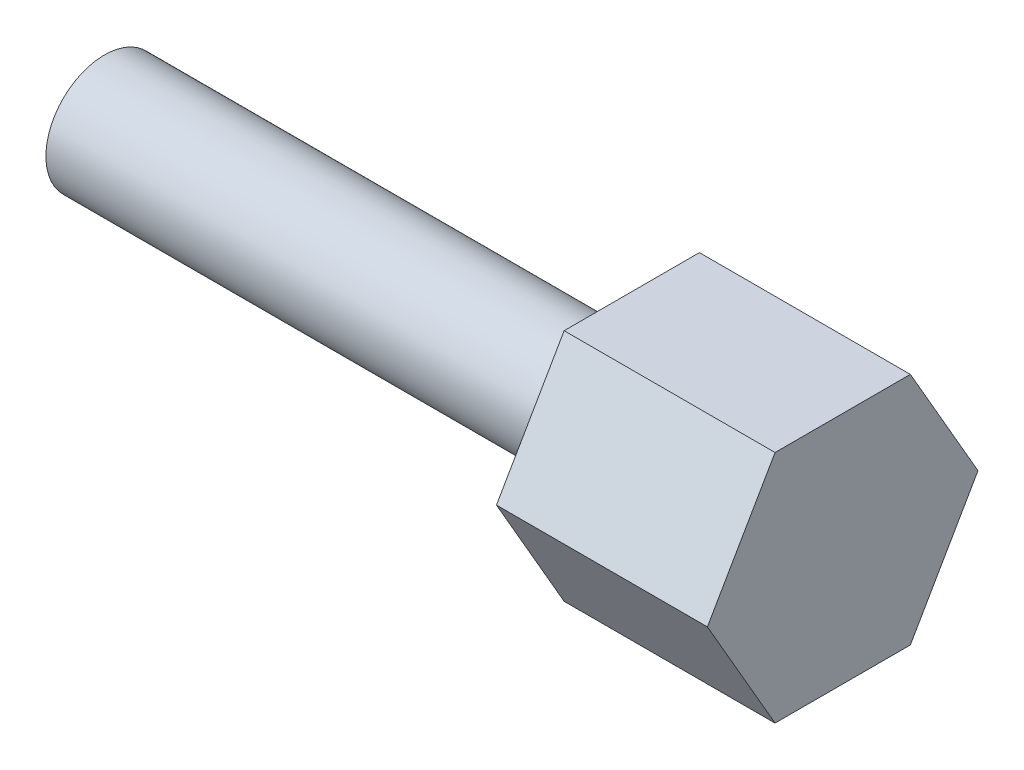
ISO-10303-21;
HEADER;
FILE_DESCRIPTION(('STEP AP214'),'2;1');
FILE_NAME('part.step','',(''),(''),'','','');
FILE_SCHEMA(('AUTOMOTIVE_DESIGN { 1 0 10303 214 1 1 1 1 }'));
ENDSEC;
DATA;
#1=APPLICATION_CONTEXT('core data for automotive mechanical design processes');
#2=APPLICATION_PROTOCOL_DEFINITION('international standard','automotive_design',2000,#1);
#3=PRODUCT_CONTEXT('',#1,'mechanical');
#4=PRODUCT('Part','Part','',(#3));
#5=PRODUCT_RELATED_PRODUCT_CATEGORY('part','',(#4));
#6=PRODUCT_DEFINITION_FORMATION('','',#4);
#7=PRODUCT_DEFINITION_CONTEXT('part definition',#1,'design');
#8=PRODUCT_DEFINITION('design','',#6,#7);
#9=PRODUCT_DEFINITION_SHAPE('','',#8);
#10=(LENGTH_UNIT() NAMED_UNIT(*) SI_UNIT(.MILLI.,.METRE.));
#11=(NAMED_UNIT(*) PLANE_ANGLE_UNIT() SI_UNIT($,.RADIAN.));
#12=(NAMED_UNIT(*) SI_UNIT($,.STERADIAN.) SOLID_ANGLE_UNIT());
#13=UNCERTAINTY_MEASURE_WITH_UNIT(LENGTH_MEASURE(1.E-05),#10,'distance_accuracy_value','');
#14=(GEOMETRIC_REPRESENTATION_CONTEXT(3) GLOBAL_UNCERTAINTY_ASSIGNED_CONTEXT((#13)) GLOBAL_UNIT_ASSIGNED_CONTEXT((#10,
#11,#12)) REPRESENTATION_CONTEXT('',''));
#15=CARTESIAN_POINT('',(0.,0.,0.));
#16=DIRECTION('',(0.,0.,1.));
#17=DIRECTION('',(1.,0.,0.));
#18=AXIS2_PLACEMENT_3D('',#15,#16,#17);
#19=CARTESIAN_POINT('',(11.43,-3.175,-5.49926131403119));
#20=DIRECTION('',(0.,0.5,0.866025403784439));
#21=DIRECTION('',(0.,-0.866025403784439,0.5));
#22=AXIS2_PLACEMENT_3D('',#19,#20,#21);
#23=PLANE('',#22);
#24=DIRECTION('',(0.,0.866025403784439,-0.5));
#25=VECTOR('',#24,1.);
#26=CARTESIAN_POINT('',(0.,-3.175,-5.49926131403119));
#27=LINE('',#26,#25);
#28=CARTESIAN_POINT('',(0.,-6.35,-3.66617420935412));
#29=VERTEX_POINT('',#28);
#30=CARTESIAN_POINT('',(0.,0.,-7.33234841870825));
#31=VERTEX_POINT('',#30);
#32=EDGE_CURVE('E118',#29,#31,#27,.T.);
#33=ORIENTED_EDGE('',*,*,#32,.T.);
#34=DIRECTION('',(-1.,0.,0.));
#35=VECTOR('',#34,1.);
#36=CARTESIAN_POINT('',(11.43,0.,-7.33234841870825));
#37=LINE('',#36,#35);
#38=CARTESIAN_POINT('',(11.43,0.,-7.33234841870825));
#39=VERTEX_POINT('',#38);
#40=EDGE_CURVE('E11',#39,#31,#37,.T.);
#41=ORIENTED_EDGE('',*,*,#40,.F.);
#42=DIRECTION('',(0.,0.866025403784439,-0.5));
#43=VECTOR('',#42,1.);
#44=CARTESIAN_POINT('',(11.43,-3.175,-5.49926131403119));
#45=LINE('',#44,#43);
#46=CARTESIAN_POINT('',(11.43,-6.35,-3.66617420935412));
#47=VERTEX_POINT('',#46);
#48=EDGE_CURVE('E129',#47,#39,#45,.T.);
#49=ORIENTED_EDGE('',*,*,#48,.F.);
#50=DIRECTION('',(-1.,0.,0.));
#51=VECTOR('',#50,1.);
#52=CARTESIAN_POINT('',(11.43,-6.35,-3.66617420935412));
#53=LINE('',#52,#51);
#54=EDGE_CURVE('E114',#47,#29,#53,.T.);
#55=ORIENTED_EDGE('',*,*,#54,.T.);
#56=EDGE_LOOP('',(#33,#41,#49,#55));
#57=FACE_BOUND('',#56,.T.);
#58=ADVANCED_FACE('F34',(#57),#23,.F.);
#59=CARTESIAN_POINT('',(11.43,3.175,-5.49926131403118));
#60=DIRECTION('',(0.,-0.5,0.866025403784438));
#61=DIRECTION('',(0.,-0.866025403784439,-0.5));
#62=AXIS2_PLACEMENT_3D('',#59,#60,#61);
#63=PLANE('',#62);
#64=DIRECTION('',(0.,0.866025403784438,0.5));
#65=VECTOR('',#64,1.);
#66=CARTESIAN_POINT('',(0.,3.175,-5.49926131403118));
#67=LINE('',#66,#65);
#68=CARTESIAN_POINT('',(0.,6.35,-3.66617420935412));
#69=VERTEX_POINT('',#68);
#70=EDGE_CURVE('E121',#31,#69,#67,.T.);
#71=ORIENTED_EDGE('',*,*,#70,.T.);
#72=DIRECTION('',(-1.,0.,0.));
#73=VECTOR('',#72,1.);
#74=CARTESIAN_POINT('',(11.43,6.35,-3.66617420935412));
#75=LINE('',#74,#73);
#76=CARTESIAN_POINT('',(11.43,6.35,-3.66617420935412));
#77=VERTEX_POINT('',#76);
#78=EDGE_CURVE('E42',#77,#69,#75,.T.);
#79=ORIENTED_EDGE('',*,*,#78,.F.);
#80=DIRECTION('',(0.,0.866025403784438,0.5));
#81=VECTOR('',#80,1.);
#82=CARTESIAN_POINT('',(11.43,3.175,-5.49926131403118));
#83=LINE('',#82,#81);
#84=EDGE_CURVE('E87',#39,#77,#83,.T.);
#85=ORIENTED_EDGE('',*,*,#84,.F.);
#86=ORIENTED_EDGE('',*,*,#40,.T.);
#87=EDGE_LOOP('',(#71,#79,#85,#86));
#88=FACE_BOUND('',#87,.T.);
#89=ADVANCED_FACE('F153',(#88),#63,.F.);
#90=CARTESIAN_POINT('',(11.43,6.35,0.));
#91=DIRECTION('',(0.,-1.,0.));
#92=DIRECTION('',(0.,0.,-1.));
#93=AXIS2_PLACEMENT_3D('',#90,#91,#92);
#94=PLANE('',#93);
#95=DIRECTION('',(0.,0.,1.));
#96=VECTOR('',#95,1.);
#97=CARTESIAN_POINT('',(0.,6.35,0.));
#98=LINE('',#97,#96);
#99=CARTESIAN_POINT('',(0.,6.35,3.66617420935412));
#100=VERTEX_POINT('',#99);
#101=EDGE_CURVE('E124',#69,#100,#98,.T.);
#102=ORIENTED_EDGE('',*,*,#101,.T.);
#103=DIRECTION('',(-1.,0.,0.));
#104=VECTOR('',#103,1.);
#105=CARTESIAN_POINT('',(11.43,6.35,3.66617420935412));
#106=LINE('',#105,#104);
#107=CARTESIAN_POINT('',(11.43,6.35,3.66617420935412));
#108=VERTEX_POINT('',#107);
#109=EDGE_CURVE('E109',#108,#100,#106,.T.);
#110=ORIENTED_EDGE('',*,*,#109,.F.);
#111=DIRECTION('',(0.,0.,1.));
#112=VECTOR('',#111,1.);
#113=CARTESIAN_POINT('',(11.43,6.35,0.));
#114=LINE('',#113,#112);
#115=EDGE_CURVE('E100',#77,#108,#114,.T.);
#116=ORIENTED_EDGE('',*,*,#115,.F.);
#117=ORIENTED_EDGE('',*,*,#78,.T.);
#118=EDGE_LOOP('',(#102,#110,#116,#117));
#119=FACE_BOUND('',#118,.T.);
#120=ADVANCED_FACE('F135',(#119),#94,.F.);
#121=CARTESIAN_POINT('',(11.43,3.175,5.49926131403119));
#122=DIRECTION('',(0.,-0.5,-0.866025403784439));
#123=DIRECTION('',(0.,0.866025403784439,-0.5));
#124=AXIS2_PLACEMENT_3D('',#121,#122,#123);
#125=PLANE('',#124);
#126=DIRECTION('',(0.,-0.866025403784439,0.5));
#127=VECTOR('',#126,1.);
#128=CARTESIAN_POINT('',(0.,3.175,5.49926131403119));
#129=LINE('',#128,#127);
#130=CARTESIAN_POINT('',(0.,0.,7.33234841870824));
#131=VERTEX_POINT('',#130);
#132=EDGE_CURVE('E108',#100,#131,#129,.T.);
#133=ORIENTED_EDGE('',*,*,#132,.T.);
#134=DIRECTION('',(-1.,0.,0.));
#135=VECTOR('',#134,1.);
#136=CARTESIAN_POINT('',(11.43,0.,7.33234841870824));
#137=LINE('',#136,#135);
#138=CARTESIAN_POINT('',(11.43,0.,7.33234841870824));
#139=VERTEX_POINT('',#138);
#140=EDGE_CURVE('E105',#139,#131,#137,.T.);
#141=ORIENTED_EDGE('',*,*,#140,.F.);
#142=DIRECTION('',(0.,-0.866025403784439,0.5));
#143=VECTOR('',#142,1.);
#144=CARTESIAN_POINT('',(11.43,3.175,5.49926131403119));
#145=LINE('',#144,#143);
#146=EDGE_CURVE('E94',#108,#139,#145,.T.);
#147=ORIENTED_EDGE('',*,*,#146,.F.);
#148=ORIENTED_EDGE('',*,*,#109,.T.);
#149=EDGE_LOOP('',(#133,#141,#147,#148));
#150=FACE_BOUND('',#149,.T.);
#151=ADVANCED_FACE('F106',(#150),#125,.F.);
#152=CARTESIAN_POINT('',(11.43,-3.175,5.49926131403118));
#153=DIRECTION('',(0.,0.5,-0.866025403784438));
#154=DIRECTION('',(0.,0.866025403784439,0.5));
#155=AXIS2_PLACEMENT_3D('',#152,#153,#154);
#156=PLANE('',#155);
#157=DIRECTION('',(0.,-0.866025403784438,-0.5));
#158=VECTOR('',#157,1.);
#159=CARTESIAN_POINT('',(0.,-3.175,5.49926131403118));
#160=LINE('',#159,#158);
#161=CARTESIAN_POINT('',(0.,-6.35,3.66617420935412));
#162=VERTEX_POINT('',#161);
#163=EDGE_CURVE('E73',#131,#162,#160,.T.);
#164=ORIENTED_EDGE('',*,*,#163,.T.);
#165=DIRECTION('',(-1.,0.,0.));
#166=VECTOR('',#165,1.);
#167=CARTESIAN_POINT('',(11.43,-6.35,3.66617420935412));
#168=LINE('',#167,#166);
#169=CARTESIAN_POINT('',(11.43,-6.35,3.66617420935412));
#170=VERTEX_POINT('',#169);
#171=EDGE_CURVE('E110',#170,#162,#168,.T.);
#172=ORIENTED_EDGE('',*,*,#171,.F.);
#173=DIRECTION('',(0.,-0.866025403784438,-0.5));
#174=VECTOR('',#173,1.);
#175=CARTESIAN_POINT('',(11.43,-3.175,5.49926131403118));
#176=LINE('',#175,#174);
#177=EDGE_CURVE('E98',#139,#170,#176,.T.);
#178=ORIENTED_EDGE('',*,*,#177,.F.);
#179=ORIENTED_EDGE('',*,*,#140,.T.);
#180=EDGE_LOOP('',(#164,#172,#178,#179));
#181=FACE_BOUND('',#180,.T.);
#182=ADVANCED_FACE('F112',(#181),#156,.F.);
#183=CARTESIAN_POINT('',(11.43,-6.35,0.));
#184=DIRECTION('',(0.,1.,0.));
#185=DIRECTION('',(0.,0.,1.));
#186=AXIS2_PLACEMENT_3D('',#183,#184,#185);
#187=PLANE('',#186);
#188=DIRECTION('',(0.,0.,-1.));
#189=VECTOR('',#188,1.);
#190=CARTESIAN_POINT('',(0.,-6.35,0.));
#191=LINE('',#190,#189);
#192=EDGE_CURVE('E79',#162,#29,#191,.T.);
#193=ORIENTED_EDGE('',*,*,#192,.T.);
#194=ORIENTED_EDGE('',*,*,#54,.F.);
#195=DIRECTION('',(0.,0.,-1.));
#196=VECTOR('',#195,1.);
#197=CARTESIAN_POINT('',(11.43,-6.35,0.));
#198=LINE('',#197,#196);
#199=EDGE_CURVE('E50',#170,#47,#198,.T.);
#200=ORIENTED_EDGE('',*,*,#199,.F.);
#201=ORIENTED_EDGE('',*,*,#171,.T.);
#202=EDGE_LOOP('',(#193,#194,#200,#201));
#203=FACE_BOUND('',#202,.T.);
#204=ADVANCED_FACE('F142',(#203),#187,.F.);
#205=CARTESIAN_POINT('',(11.43,0.,0.));
#206=DIRECTION('',(1.,0.,0.));
#207=DIRECTION('',(0.,0.,-1.));
#208=AXIS2_PLACEMENT_3D('',#205,#206,#207);
#209=PLANE('',#208);
#210=ORIENTED_EDGE('',*,*,#48,.T.);
#211=ORIENTED_EDGE('',*,*,#84,.T.);
#212=ORIENTED_EDGE('',*,*,#115,.T.);
#213=ORIENTED_EDGE('',*,*,#146,.T.);
#214=ORIENTED_EDGE('',*,*,#177,.T.);
#215=ORIENTED_EDGE('',*,*,#199,.T.);
#216=EDGE_LOOP('',(#210,#211,#212,#213,#214,#215));
#217=FACE_BOUND('',#216,.T.);
#218=ADVANCED_FACE('F96',(#217),#209,.T.);
#219=CARTESIAN_POINT('',(0.,0.,0.));
#220=DIRECTION('',(1.,0.,0.));
#221=DIRECTION('',(0.,0.,-1.));
#222=AXIS2_PLACEMENT_3D('',#219,#220,#221);
#223=PLANE('',#222);
#224=CARTESIAN_POINT('',(0.,0.,0.));
#225=DIRECTION('',(1.,0.,0.));
#226=DIRECTION('',(0.,0.,-1.));
#227=AXIS2_PLACEMENT_3D('',#224,#225,#226);
#228=CIRCLE('',#227,3.175);
#229=CARTESIAN_POINT('',(0.,0.,-3.175));
#230=VERTEX_POINT('',#229);
#231=EDGE_CURVE('E215',#230,#230,#228,.T.);
#232=ORIENTED_EDGE('',*,*,#231,.T.);
#233=EDGE_LOOP('',(#232));
#234=FACE_BOUND('',#233,.T.);
#235=ORIENTED_EDGE('',*,*,#32,.F.);
#236=ORIENTED_EDGE('',*,*,#192,.F.);
#237=ORIENTED_EDGE('',*,*,#163,.F.);
#238=ORIENTED_EDGE('',*,*,#132,.F.);
#239=ORIENTED_EDGE('',*,*,#101,.F.);
#240=ORIENTED_EDGE('',*,*,#70,.F.);
#241=EDGE_LOOP('',(#235,#236,#237,#238,#239,#240));
#242=FACE_BOUND('',#241,.T.);
#243=ADVANCED_FACE('F138',(#234,#242),#223,.F.);
#244=CARTESIAN_POINT('',(-28.575,0.,0.));
#245=DIRECTION('',(1.,0.,0.));
#246=DIRECTION('',(0.,0.,-1.));
#247=AXIS2_PLACEMENT_3D('',#244,#245,#246);
#248=CYLINDRICAL_SURFACE('',#247,3.175);
#249=CARTESIAN_POINT('',(-28.575,0.,0.));
#250=DIRECTION('',(1.,0.,0.));
#251=DIRECTION('',(0.,0.,-1.));
#252=AXIS2_PLACEMENT_3D('',#249,#250,#251);
#253=CIRCLE('',#252,3.175);
#254=CARTESIAN_POINT('',(-28.575,0.,-3.175));
#255=VERTEX_POINT('',#254);
#256=EDGE_CURVE('E122',#255,#255,#253,.T.);
#257=ORIENTED_EDGE('',*,*,#256,.T.);
#258=EDGE_LOOP('',(#257));
#259=FACE_BOUND('',#258,.T.);
#260=ORIENTED_EDGE('',*,*,#231,.F.);
#261=EDGE_LOOP('',(#260));
#262=FACE_BOUND('',#261,.T.);
#263=ADVANCED_FACE('F190',(#259,#262),#248,.T.);
#264=CARTESIAN_POINT('',(-28.575,0.,0.));
#265=DIRECTION('',(1.,0.,0.));
#266=DIRECTION('',(0.,0.,-1.));
#267=AXIS2_PLACEMENT_3D('',#264,#265,#266);
#268=PLANE('',#267);
#269=ORIENTED_EDGE('',*,*,#256,.F.);
#270=EDGE_LOOP('',(#269));
#271=FACE_BOUND('',#270,.T.);
#272=ADVANCED_FACE('F199',(#271),#268,.F.);
#273=CLOSED_SHELL('',(#58,#89,#120,#151,#182,#204,#218,#243,#263,#272));
#274=MANIFOLD_SOLID_BREP('B2',#273);
#275=ADVANCED_BREP_SHAPE_REPRESENTATION('',(#18,#274),#14);
#276=SHAPE_DEFINITION_REPRESENTATION(#9,#275);
ENDSEC;
END-ISO-10303-21;
